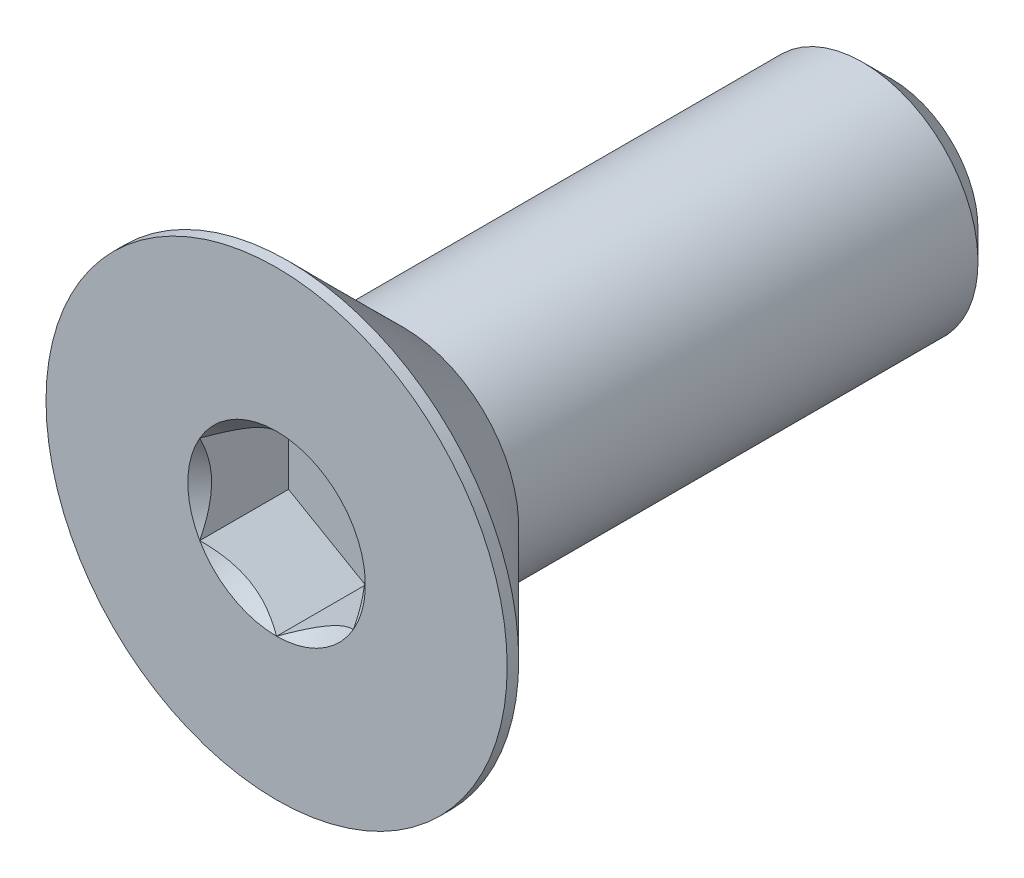
ISO-10303-21;
HEADER;
FILE_DESCRIPTION(('STEP AP214'),'2;1');
FILE_NAME('part.step','',(''),(''),'','','');
FILE_SCHEMA(('AUTOMOTIVE_DESIGN { 1 0 10303 214 1 1 1 1 }'));
ENDSEC;
DATA;
#1=APPLICATION_CONTEXT('core data for automotive mechanical design processes');
#2=APPLICATION_PROTOCOL_DEFINITION('international standard','automotive_design',2000,#1);
#3=PRODUCT_CONTEXT('',#1,'mechanical');
#4=PRODUCT('Part','Part','',(#3));
#5=PRODUCT_RELATED_PRODUCT_CATEGORY('part','',(#4));
#6=PRODUCT_DEFINITION_FORMATION('','',#4);
#7=PRODUCT_DEFINITION_CONTEXT('part definition',#1,'design');
#8=PRODUCT_DEFINITION('design','',#6,#7);
#9=PRODUCT_DEFINITION_SHAPE('','',#8);
#10=(LENGTH_UNIT() NAMED_UNIT(*) SI_UNIT(.MILLI.,.METRE.));
#11=(NAMED_UNIT(*) PLANE_ANGLE_UNIT() SI_UNIT($,.RADIAN.));
#12=(NAMED_UNIT(*) SI_UNIT($,.STERADIAN.) SOLID_ANGLE_UNIT());
#13=UNCERTAINTY_MEASURE_WITH_UNIT(LENGTH_MEASURE(1.E-05),#10,'distance_accuracy_value','');
#14=(GEOMETRIC_REPRESENTATION_CONTEXT(3) GLOBAL_UNCERTAINTY_ASSIGNED_CONTEXT((#13)) GLOBAL_UNIT_ASSIGNED_CONTEXT((#10,
#11,#12)) REPRESENTATION_CONTEXT('',''));
#15=CARTESIAN_POINT('',(0.,0.,0.));
#16=DIRECTION('',(0.,0.,1.));
#17=DIRECTION('',(1.,0.,0.));
#18=AXIS2_PLACEMENT_3D('',#15,#16,#17);
#19=CARTESIAN_POINT('',(2.22044604925031E-13,0.,-16.));
#20=DIRECTION('',(0.,0.,-1.));
#21=DIRECTION('',(0.,1.,0.));
#22=AXIS2_PLACEMENT_3D('',#19,#20,#21);
#23=CYLINDRICAL_SURFACE('',#22,3.);
#24=CARTESIAN_POINT('',(0.,0.,-15.25));
#25=DIRECTION('',(0.,0.,-1.));
#26=DIRECTION('',(0.,1.,0.));
#27=AXIS2_PLACEMENT_3D('',#24,#25,#26);
#28=CIRCLE('',#27,3.);
#29=CARTESIAN_POINT('',(0.,3.,-15.25));
#30=VERTEX_POINT('',#29);
#31=EDGE_CURVE('E55',#30,#30,#28,.F.);
#32=ORIENTED_EDGE('',*,*,#31,.T.);
#33=EDGE_LOOP('',(#32));
#34=FACE_BOUND('',#33,.T.);
#35=CARTESIAN_POINT('',(1.11022302462516E-13,0.,-3.3));
#36=DIRECTION('',(0.,0.,1.));
#37=DIRECTION('',(0.,-1.,0.));
#38=AXIS2_PLACEMENT_3D('',#35,#36,#37);
#39=CIRCLE('',#38,3.00000000000001);
#40=CARTESIAN_POINT('',(1.11022302462516E-13,-3.00000000000001,-3.29999999999999));
#41=VERTEX_POINT('',#40);
#42=EDGE_CURVE('E195',#41,#41,#39,.T.);
#43=ORIENTED_EDGE('',*,*,#42,.F.);
#44=EDGE_LOOP('',(#43));
#45=FACE_BOUND('',#44,.T.);
#46=ADVANCED_FACE('F40',(#34,#45),#23,.T.);
#47=CARTESIAN_POINT('',(2.22044604925031E-13,-2.99999999999984,-16.));
#48=DIRECTION('',(0.,0.,-1.));
#49=DIRECTION('',(0.,1.,0.));
#50=AXIS2_PLACEMENT_3D('',#47,#48,#49);
#51=PLANE('',#50);
#52=CARTESIAN_POINT('',(2.22044604925031E-13,0.,-16.));
#53=DIRECTION('',(0.,0.,-1.));
#54=DIRECTION('',(0.,1.,0.));
#55=AXIS2_PLACEMENT_3D('',#52,#53,#54);
#56=CIRCLE('',#55,2.25);
#57=CARTESIAN_POINT('',(2.22044604925031E-13,2.25000000000006,-16.));
#58=VERTEX_POINT('',#57);
#59=EDGE_CURVE('E207',#58,#58,#56,.T.);
#60=ORIENTED_EDGE('',*,*,#59,.T.);
#61=EDGE_LOOP('',(#60));
#62=FACE_BOUND('',#61,.T.);
#63=ADVANCED_FACE('F220',(#62),#51,.T.);
#64=CARTESIAN_POINT('',(2.22044604925031E-13,0.,-16.));
#65=DIRECTION('',(0.,0.,1.));
#66=DIRECTION('',(0.,-1.,0.));
#67=AXIS2_PLACEMENT_3D('',#64,#65,#66);
#68=CONICAL_SURFACE('',#67,2.25,0.785398163397445);
#69=ORIENTED_EDGE('',*,*,#31,.F.);
#70=EDGE_LOOP('',(#69));
#71=FACE_BOUND('',#70,.T.);
#72=ORIENTED_EDGE('',*,*,#59,.F.);
#73=EDGE_LOOP('',(#72));
#74=FACE_BOUND('',#73,.T.);
#75=ADVANCED_FACE('F42',(#71,#74),#68,.T.);
#76=CARTESIAN_POINT('',(0.,0.,0.));
#77=DIRECTION('',(0.,0.,1.));
#78=DIRECTION('',(0.,-1.,0.));
#79=AXIS2_PLACEMENT_3D('',#76,#77,#78);
#80=CYLINDRICAL_SURFACE('',#79,6.);
#81=CARTESIAN_POINT('',(0.,0.,0.));
#82=DIRECTION('',(0.,0.,1.));
#83=DIRECTION('',(0.,-1.,0.));
#84=AXIS2_PLACEMENT_3D('',#81,#82,#83);
#85=CIRCLE('',#84,6.);
#86=CARTESIAN_POINT('',(0.,-6.,0.));
#87=VERTEX_POINT('',#86);
#88=EDGE_CURVE('E203',#87,#87,#85,.T.);
#89=ORIENTED_EDGE('',*,*,#88,.F.);
#90=EDGE_LOOP('',(#89));
#91=FACE_BOUND('',#90,.T.);
#92=CARTESIAN_POINT('',(1.11022302462516E-13,0.,-0.300000000000022));
#93=DIRECTION('',(0.,0.,1.));
#94=DIRECTION('',(0.,-1.,0.));
#95=AXIS2_PLACEMENT_3D('',#92,#93,#94);
#96=CIRCLE('',#95,6.);
#97=CARTESIAN_POINT('',(1.11022302462516E-13,-5.99999999999995,-0.300000000000015));
#98=VERTEX_POINT('',#97);
#99=EDGE_CURVE('E199',#98,#98,#96,.T.);
#100=ORIENTED_EDGE('',*,*,#99,.T.);
#101=EDGE_LOOP('',(#100));
#102=FACE_BOUND('',#101,.T.);
#103=ADVANCED_FACE('F219',(#91,#102),#80,.T.);
#104=CARTESIAN_POINT('',(1.11022302462516E-13,0.,-3.3));
#105=DIRECTION('',(0.,0.,1.));
#106=DIRECTION('',(0.,-1.,0.));
#107=AXIS2_PLACEMENT_3D('',#104,#105,#106);
#108=CONICAL_SURFACE('',#107,3.00000000000001,0.785398163397449);
#109=ORIENTED_EDGE('',*,*,#99,.F.);
#110=EDGE_LOOP('',(#109));
#111=FACE_BOUND('',#110,.T.);
#112=ORIENTED_EDGE('',*,*,#42,.T.);
#113=EDGE_LOOP('',(#112));
#114=FACE_BOUND('',#113,.T.);
#115=ADVANCED_FACE('F230',(#111,#114),#108,.T.);
#116=CARTESIAN_POINT('',(1.11022302462516E-13,-2.99999999999989,0.));
#117=DIRECTION('',(0.,0.,1.));
#118=DIRECTION('',(0.,-1.,0.));
#119=AXIS2_PLACEMENT_3D('',#116,#117,#118);
#120=PLANE('',#119);
#121=CARTESIAN_POINT('',(0.,0.,0.));
#122=DIRECTION('',(0.,0.,1.));
#123=DIRECTION('',(1.,0.,0.));
#124=AXIS2_PLACEMENT_3D('',#121,#122,#123);
#125=CIRCLE('',#124,2.3094010767585);
#126=CARTESIAN_POINT('',(-1.11022302462516E-13,-2.30940107675831,0.));
#127=VERTEX_POINT('',#126);
#128=CARTESIAN_POINT('',(2.,-1.15470053837913,0.));
#129=VERTEX_POINT('',#128);
#130=EDGE_CURVE('E101',#127,#129,#125,.T.);
#131=ORIENTED_EDGE('',*,*,#130,.F.);
#132=CARTESIAN_POINT('',(-1.99999999999989,-1.15470053837918,0.));
#133=VERTEX_POINT('',#132);
#134=EDGE_CURVE('E61',#133,#127,#125,.T.);
#135=ORIENTED_EDGE('',*,*,#134,.F.);
#136=CARTESIAN_POINT('',(-2.,1.15470053837924,0.));
#137=VERTEX_POINT('',#136);
#138=EDGE_CURVE('E152',#137,#133,#125,.T.);
#139=ORIENTED_EDGE('',*,*,#138,.F.);
#140=CARTESIAN_POINT('',(-2.22044604925031E-13,2.3094010767587,0.));
#141=VERTEX_POINT('',#140);
#142=EDGE_CURVE('E68',#141,#137,#125,.T.);
#143=ORIENTED_EDGE('',*,*,#142,.F.);
#144=CARTESIAN_POINT('',(1.99999999999978,1.15470053837946,0.));
#145=VERTEX_POINT('',#144);
#146=EDGE_CURVE('E140',#145,#141,#125,.T.);
#147=ORIENTED_EDGE('',*,*,#146,.F.);
#148=EDGE_CURVE('E110',#129,#145,#125,.T.);
#149=ORIENTED_EDGE('',*,*,#148,.F.);
#150=EDGE_LOOP('',(#131,#135,#139,#143,#147,#149));
#151=FACE_BOUND('',#150,.T.);
#152=ORIENTED_EDGE('',*,*,#88,.T.);
#153=EDGE_LOOP('',(#152));
#154=FACE_BOUND('',#153,.T.);
#155=ADVANCED_FACE('F138',(#151,#154),#120,.T.);
#156=CARTESIAN_POINT('',(0.,0.,0.));
#157=DIRECTION('',(0.,0.,1.));
#158=DIRECTION('',(1.,0.,0.));
#159=AXIS2_PLACEMENT_3D('',#156,#157,#158);
#160=CONICAL_SURFACE('',#159,2.3094010767585,0.78539816339745);
#161=ORIENTED_EDGE('',*,*,#148,.T.);
#162=CARTESIAN_POINT('',(2.00000000000011,-2.30294417326427,0.740771355280688));
#163=CARTESIAN_POINT('',(2.00000000000011,-2.24687002696274,0.698443273869221));
#164=CARTESIAN_POINT('',(2.00000000000011,-2.19048190568578,0.656525157097884));
#165=CARTESIAN_POINT('',(2.00000000000011,-2.07695390526148,0.573690418075182));
#166=CARTESIAN_POINT('',(2.00000000000011,-2.01981384095226,0.532774049872569));
#167=CARTESIAN_POINT('',(2.00000000000011,-1.90424016831611,0.451833452203649));
#168=CARTESIAN_POINT('',(2.00000000000011,-1.8457999676976,0.411818591735218));
#169=CARTESIAN_POINT('',(2.00000000000011,-1.72792745485623,0.333288993820327));
#170=CARTESIAN_POINT('',(2.00000000000011,-1.66849521315183,0.294774150389594));
#171=CARTESIAN_POINT('',(2.00000000000011,-1.4816299572957,0.177640651720354));
#172=CARTESIAN_POINT('',(2.00000000000011,-1.35220318180733,0.102145901825405));
#173=CARTESIAN_POINT('',(2.00000000000011,-1.08689521605221,-0.0359506489476411));
#174=CARTESIAN_POINT('',(2.00000000000011,-0.951037764035708,-0.0985959140560371));
#175=CARTESIAN_POINT('',(2.00000000000011,-0.747111912337708,-0.175236456097212));
#176=CARTESIAN_POINT('',(2.00000000000011,-0.682064034234178,-0.197232820052666));
#177=CARTESIAN_POINT('',(2.00000000000011,-0.550398103397349,-0.236003312312233));
#178=CARTESIAN_POINT('',(2.00000000000011,-0.483779942833362,-0.25277708085234));
#179=CARTESIAN_POINT('',(2.00000000000011,-0.350484328974839,-0.279951742093204));
#180=CARTESIAN_POINT('',(2.00000000000011,-0.283829489499974,-0.290461823238892));
#181=CARTESIAN_POINT('',(2.00000000000011,-0.149806987290315,-0.304903914443445));
#182=CARTESIAN_POINT('',(2.00000000000011,-0.0824394490928071,-0.3088370552601));
#183=CARTESIAN_POINT('',(2.00000000000011,0.0499055621214823,-0.309833523070376));
#184=CARTESIAN_POINT('',(2.00000000000012,0.114881284963569,-0.30714035515963));
#185=CARTESIAN_POINT('',(2.00000000000011,0.244275921290632,-0.295569929600288));
#186=CARTESIAN_POINT('',(2.0000000000001,0.308694780068696,-0.286692071196753));
#187=CARTESIAN_POINT('',(2.00000000000012,0.437599788400936,-0.263086340748452));
#188=CARTESIAN_POINT('',(2.00000000000016,0.502067428429062,-0.248258916605757));
#189=CARTESIAN_POINT('',(2.00000000000007,0.629594322371815,-0.213542116439877));
#190=CARTESIAN_POINT('',(1.99999999999994,0.692653693651466,-0.19365316396948));
#191=CARTESIAN_POINT('',(1.99999999999978,0.891187888928423,-0.123553020856651));
#192=CARTESIAN_POINT('',(2.00000000000003,1.02383545674819,-0.0653581998253135));
#193=CARTESIAN_POINT('',(2.0000000000002,1.2829093210937,0.0640305752409503));
#194=CARTESIAN_POINT('',(2.00000000000013,1.40931112542926,0.135271231158357));
#195=CARTESIAN_POINT('',(2.00000000000011,1.5920044138885,0.246441991562786));
#196=CARTESIAN_POINT('',(2.00000000000011,1.65027548974478,0.283182190008393));
#197=CARTESIAN_POINT('',(2.00000000000011,1.76581760334352,0.358214513820608));
#198=CARTESIAN_POINT('',(2.00000000000011,1.82308856486637,0.396506756737753));
#199=CARTESIAN_POINT('',(2.00000000000012,1.93629654702499,0.474042263666883));
#200=CARTESIAN_POINT('',(2.00000000000013,1.99224062439413,0.513275275702316));
#201=CARTESIAN_POINT('',(2.00000000000009,2.10336423965705,0.592778830271386));
#202=CARTESIAN_POINT('',(2.00000000000003,2.15854398356745,0.633049084518533));
#203=CARTESIAN_POINT('',(1.99999999999989,2.21340370625411,0.673744237646934));
#204=B_SPLINE_CURVE_WITH_KNOTS('',3,(#162,#163,#164,#165,#166,#167,#168,#169,#170,#171,#172,
#173,#174,#175,#176,#177,#178,#179,#180,#181,#182,#183,#184,#185,#186,#187,#188,#189,#190,#191,
#192,#193,#194,#195,#196,#197,#198,#199,#200,#201,#202,#203),.UNSPECIFIED.,.F.,.F.,(4,2,2,2,2,2,
2,2,2,2,2,2,2,2,2,2,2,2,2,2,4),(0.,0.210772732016981,0.421598374738784,0.634057554744567,
0.846501696032124,1.29562155480986,1.74319622856084,1.94902062142325,2.15485918958128,
2.35699582530217,2.559097704575,2.75388435576873,2.94868993036088,3.14690093471659,
3.34509535806575,3.77838155838755,4.21325029906854,4.41989056664086,4.62654651432571,
4.83152377076239,5.03644465872335),.UNSPECIFIED.);
#205=EDGE_CURVE('E11',#129,#145,#204,.T.);
#206=ORIENTED_EDGE('',*,*,#205,.F.);
#207=EDGE_LOOP('',(#161,#206));
#208=FACE_BOUND('',#207,.T.);
#209=ADVANCED_FACE('F114',(#208),#160,.F.);
#210=ORIENTED_EDGE('',*,*,#146,.T.);
#211=CARTESIAN_POINT('',(2.00020000000012,1.15458506832544,0.000115478713612338));
#212=CARTESIAN_POINT('',(1.9314469659693,1.1942796510305,-0.0395469097745199));
#213=CARTESIAN_POINT('',(1.86154425786446,1.23463799837186,-0.0768800177159727));
#214=CARTESIAN_POINT('',(1.7190047554495,1.31693321846128,-0.145236314864007));
#215=CARTESIAN_POINT('',(1.64635440243459,1.3588779193312,-0.176221466262924));
#216=CARTESIAN_POINT('',(1.49985839894594,1.44345742638051,-0.229299783456038));
#217=CARTESIAN_POINT('',(1.42605006475357,1.4860706879948,-0.251526372823611));
#218=CARTESIAN_POINT('',(1.27680836816469,1.57223542169499,-0.285771183325048));
#219=CARTESIAN_POINT('',(1.20137956608194,1.6157842608825,-0.297814970855859));
#220=CARTESIAN_POINT('',(1.07138449932894,1.69083694766554,-0.308681488094468));
#221=CARTESIAN_POINT('',(1.01698621602979,1.72224381117146,-0.310290246390173));
#222=CARTESIAN_POINT('',(0.908278544480123,1.78500621460344,-0.307581122401498));
#223=CARTESIAN_POINT('',(0.853969194078523,1.8163617326774,-0.303261162242198));
#224=CARTESIAN_POINT('',(0.745863272410539,1.87877671565343,-0.288940432590264));
#225=CARTESIAN_POINT('',(0.692067343445055,1.90983580972289,-0.278933307238198));
#226=CARTESIAN_POINT('',(0.585405737694339,1.97141691651537,-0.253787569750469));
#227=CARTESIAN_POINT('',(0.532539989929295,2.0019389702186,-0.238649350957778));
#228=CARTESIAN_POINT('',(0.397120266910167,2.08012358375739,-0.193705496570737));
#229=CARTESIAN_POINT('',(0.315406165150329,2.12730124240477,-0.160511160574251));
#230=CARTESIAN_POINT('',(0.195252962741871,2.19667172615917,-0.104474176828706));
#231=CARTESIAN_POINT('',(0.155657147890482,2.2195323805224,-0.0847852970531069));
#232=CARTESIAN_POINT('',(0.0771990411117786,2.26483018959127,-0.0436126816351308));
#233=CARTESIAN_POINT('',(0.0383363164059168,2.28726759416172,-0.0221300483487393));
#234=CARTESIAN_POINT('',(-0.000200000000338818,2.30951654681255,0.000115478713640094));
#235=B_SPLINE_CURVE_WITH_KNOTS('',3,(#211,#212,#213,#214,#215,#216,#217,#218,#219,#220,#221,
#222,#223,#224,#225,#226,#227,#228,#229,#230,#231,#232,#233,#234),.UNSPECIFIED.,.F.,.F.,(4,2,2,
2,2,2,2,2,2,2,2,4),(0.,0.266420613771152,0.534393751523502,0.798110374377044,1.06116288956954,
1.2493990680374,1.43770123566264,1.62621426093946,1.81471283831929,2.11415604834179,
2.26347170717833,2.41269626969823),.UNSPECIFIED.);
#236=EDGE_CURVE('E145',#145,#141,#235,.T.);
#237=ORIENTED_EDGE('',*,*,#236,.F.);
#238=EDGE_LOOP('',(#210,#237));
#239=FACE_BOUND('',#238,.T.);
#240=ADVANCED_FACE('F333',(#239),#160,.F.);
#241=ORIENTED_EDGE('',*,*,#142,.T.);
#242=CARTESIAN_POINT('',(0.000199999999894729,2.30951654681233,0.000115478713640094));
#243=CARTESIAN_POINT('',(-0.0685530340308628,2.26982196410714,-0.0395469097743652));
#244=CARTESIAN_POINT('',(-0.138455742135685,2.22946361676576,-0.0768800177157799));
#245=CARTESIAN_POINT('',(-0.280995244550633,2.14716839667634,-0.145236314863797));
#246=CARTESIAN_POINT('',(-0.353645597565564,2.10522369580644,-0.176221466262731));
#247=CARTESIAN_POINT('',(-0.500141601054214,2.02064418875708,-0.229299783455776));
#248=CARTESIAN_POINT('',(-0.573949935246565,1.97803092714272,-0.251526372823264));
#249=CARTESIAN_POINT('',(-0.723191631835499,1.8918661934427,-0.285771183324878));
#250=CARTESIAN_POINT('',(-0.798620433918323,1.84831735425541,-0.297814970855952));
#251=CARTESIAN_POINT('',(-0.928615500671235,1.77326466747234,-0.308681488094448));
#252=CARTESIAN_POINT('',(-0.983013783970277,1.74185780396627,-0.310290246389937));
#253=CARTESIAN_POINT('',(-1.09172145551984,1.67909540053421,-0.307581122401118));
#254=CARTESIAN_POINT('',(-1.14603080592144,1.6477398824603,-0.303261162241888));
#255=CARTESIAN_POINT('',(-1.25413672758939,1.58532489948432,-0.288940432589972));
#256=CARTESIAN_POINT('',(-1.30793265655484,1.55426580541486,-0.278933307237853));
#257=CARTESIAN_POINT('',(-1.41459426230554,1.49268469862241,-0.253787569750255));
#258=CARTESIAN_POINT('',(-1.46746001007061,1.46216264491921,-0.238649350957748));
#259=CARTESIAN_POINT('',(-1.60287973308968,1.38397803138048,-0.193705496570861));
#260=CARTESIAN_POINT('',(-1.68459383484936,1.33680037273312,-0.160511160574155));
#261=CARTESIAN_POINT('',(-1.80474703725771,1.26742988897877,-0.104474176828581));
#262=CARTESIAN_POINT('',(-1.84434285210909,1.24456923461555,-0.08478529705302));
#263=CARTESIAN_POINT('',(-1.92280095888775,1.1992714255467,-0.0436126816351175));
#264=CARTESIAN_POINT('',(-1.96166368359358,1.17683402097627,-0.0221300483487614));
#265=CARTESIAN_POINT('',(-2.00019999999979,1.15458506832544,0.000115478713640094));
#266=B_SPLINE_CURVE_WITH_KNOTS('',3,(#242,#243,#244,#245,#246,#247,#248,#249,#250,#251,#252,
#253,#254,#255,#256,#257,#258,#259,#260,#261,#262,#263,#264,#265),.UNSPECIFIED.,.F.,.F.,(4,2,2,
2,2,2,2,2,2,2,2,4),(0.,0.266420613771059,0.534393751523439,0.798110374376992,1.06116288956944,
1.24939906803719,1.43770123566236,1.62621426093912,1.81471283831884,2.11415604834112,
2.26347170717756,2.41269626969734),.UNSPECIFIED.);
#267=EDGE_CURVE('E151',#141,#137,#266,.T.);
#268=ORIENTED_EDGE('',*,*,#267,.F.);
#269=EDGE_LOOP('',(#241,#268));
#270=FACE_BOUND('',#269,.T.);
#271=ADVANCED_FACE('F329',(#270),#160,.F.);
#272=ORIENTED_EDGE('',*,*,#138,.T.);
#273=CARTESIAN_POINT('',(-2.,-2.3029441729292,0.740771355027724));
#274=CARTESIAN_POINT('',(-2.,-2.2468700266371,0.698443273625958));
#275=CARTESIAN_POINT('',(-2.,-2.19048190536958,0.65652515686433));
#276=CARTESIAN_POINT('',(-2.,-2.07695390496424,0.573690417861012));
#277=CARTESIAN_POINT('',(-2.,-2.01981384066454,0.532774049668073));
#278=CARTESIAN_POINT('',(-2.,-1.90424016804776,0.451833452018567));
#279=CARTESIAN_POINT('',(-2.,-1.8457999674391,0.411818591559874));
#280=CARTESIAN_POINT('',(-2.,-1.72792745461761,0.333288993664303));
#281=CARTESIAN_POINT('',(-2.,-1.66849521292325,0.294774150243153));
#282=CARTESIAN_POINT('',(-2.00000000000001,-1.48162995710022,0.177640651604314));
#283=CARTESIAN_POINT('',(-2.00000000000005,-1.35220318163539,0.102145901729672));
#284=CARTESIAN_POINT('',(-1.99999999999996,-1.0868952159293,-0.0359506490055974));
#285=CARTESIAN_POINT('',(-1.99999999999984,-0.951037763938264,-0.0985959140964972));
#286=CARTESIAN_POINT('',(-1.99999999999992,-0.747111912259461,-0.175236456124851));
#287=CARTESIAN_POINT('',(-1.99999999999998,-0.682064034147896,-0.197232820080873));
#288=CARTESIAN_POINT('',(-2.00000000000002,-0.550398103294713,-0.236003312339866));
#289=CARTESIAN_POINT('',(-2.00000000000001,-0.483779942722407,-0.252777080878832));
#290=CARTESIAN_POINT('',(-2.,-0.350484328847527,-0.279951742115577));
#291=CARTESIAN_POINT('',(-2.,-0.283829489364628,-0.290461823258335));
#292=CARTESIAN_POINT('',(-2.,-0.149806987139159,-0.3049039144551));
#293=CARTESIAN_POINT('',(-2.,-0.0824394489338748,-0.308837055266897));
#294=CARTESIAN_POINT('',(-2.,0.0499055622947484,-0.309833523066275));
#295=CARTESIAN_POINT('',(-2.,0.114881285143413,-0.307140355149575));
#296=CARTESIAN_POINT('',(-2.,0.244275921482964,-0.29556992957728));
#297=CARTESIAN_POINT('',(-2.,0.308694780266939,-0.286692071166745));
#298=CARTESIAN_POINT('',(-2.,0.437599788610853,-0.263086340703817));
#299=CARTESIAN_POINT('',(-2.,0.502067428644725,-0.248258916553454));
#300=CARTESIAN_POINT('',(-2.,0.629594322598399,-0.213542116372));
#301=CARTESIAN_POINT('',(-2.,0.692653693883225,-0.193653163893698));
#302=CARTESIAN_POINT('',(-2.,0.891187889210607,-0.123553020743775));
#303=CARTESIAN_POINT('',(-2.,1.02383545707313,-0.0653581996784601));
#304=CARTESIAN_POINT('',(-2.,1.28290932150082,0.0640305754596179));
#305=CARTESIAN_POINT('',(-2.,1.40931112587578,0.135271231414888));
#306=CARTESIAN_POINT('',(-2.,1.59200441438972,0.246441991874775));
#307=CARTESIAN_POINT('',(-2.,1.650275490262,0.283182190337432));
#308=CARTESIAN_POINT('',(-2.,1.76581760389252,0.358214514183827));
#309=CARTESIAN_POINT('',(-2.,1.82308856543114,0.396506757118102));
#310=CARTESIAN_POINT('',(-2.,1.93629654762094,0.474042264081296));
#311=CARTESIAN_POINT('',(-2.00000000000001,1.99224062500548,0.513275276133663));
#312=CARTESIAN_POINT('',(-1.99999999999999,2.10336424029911,0.592778830736584));
#313=CARTESIAN_POINT('',(-1.99999999999996,2.1585439842248,0.633049085000649));
#314=CARTESIAN_POINT('',(-1.99999999999989,2.21340370692674,0.673744238145951));
#315=B_SPLINE_CURVE_WITH_KNOTS('',3,(#273,#274,#275,#276,#277,#278,#279,#280,#281,#282,#283,
#284,#285,#286,#287,#288,#289,#290,#291,#292,#293,#294,#295,#296,#297,#298,#299,#300,#301,#302,
#303,#304,#305,#306,#307,#308,#309,#310,#311,#312,#313,#314),.UNSPECIFIED.,.F.,.F.,(4,2,2,2,2,2,
2,2,2,2,2,2,2,2,2,2,2,2,2,2,4),(0.,0.210772731976878,0.421598374658564,0.634057554623451,
0.846501695870122,1.29562155455616,1.74319622821635,1.94902062110206,2.15485918928333,
2.35699582502652,2.55909770432165,2.75388435553576,2.94868993014829,3.14690093452595,
3.34509535789705,3.77838155837659,4.21325029921632,4.41989056685655,4.6265465146093,
4.83152377111299,5.03644465914096),.UNSPECIFIED.);
#316=EDGE_CURVE('E164',#137,#133,#315,.F.);
#317=ORIENTED_EDGE('',*,*,#316,.F.);
#318=EDGE_LOOP('',(#272,#317));
#319=FACE_BOUND('',#318,.T.);
#320=ADVANCED_FACE('F162',(#319),#160,.F.);
#321=ORIENTED_EDGE('',*,*,#134,.T.);
#322=CARTESIAN_POINT('',(-2.00020000000001,-1.15458506832544,0.000115478713674788));
#323=CARTESIAN_POINT('',(-1.93144696596926,-1.19427965103055,-0.0395469097745041));
#324=CARTESIAN_POINT('',(-1.86154425786443,-1.23463799837191,-0.076880017715971));
#325=CARTESIAN_POINT('',(-1.71900475544949,-1.31693321846129,-0.145236314864008));
#326=CARTESIAN_POINT('',(-1.64635440243457,-1.35887791933119,-0.176221466262913));
#327=CARTESIAN_POINT('',(-1.49985839894595,-1.44345742638055,-0.229299783456026));
#328=CARTESIAN_POINT('',(-1.42605006475362,-1.48607068799492,-0.251526372823607));
#329=CARTESIAN_POINT('',(-1.27680836816461,-1.57223542169492,-0.285771183325032));
#330=CARTESIAN_POINT('',(-1.2013795660817,-1.61578426088216,-0.297814970855822));
#331=CARTESIAN_POINT('',(-1.07138449932874,-1.6908369476653,-0.308681488094435));
#332=CARTESIAN_POINT('',(-1.01698621602971,-1.72224381117143,-0.310290246390152));
#333=CARTESIAN_POINT('',(-0.908278544480125,-1.78500621460355,-0.307581122401487));
#334=CARTESIAN_POINT('',(-0.853969194078488,-1.81636173267746,-0.303261162242185));
#335=CARTESIAN_POINT('',(-0.745863272410497,-1.87877671565346,-0.288940432590236));
#336=CARTESIAN_POINT('',(-0.692067343445043,-1.90983580972296,-0.278933307238159));
#337=CARTESIAN_POINT('',(-0.585405737694296,-1.97141691651538,-0.253787569750464));
#338=CARTESIAN_POINT('',(-0.532539989929193,-2.00193897021851,-0.238649350957818));
#339=CARTESIAN_POINT('',(-0.397120266910124,-2.08012358375719,-0.193705496570826));
#340=CARTESIAN_POINT('',(-0.31540616515048,-2.12730124240464,-0.1605111605743));
#341=CARTESIAN_POINT('',(-0.195252962742172,-2.19667172615904,-0.104474176828833));
#342=CARTESIAN_POINT('',(-0.155657147890809,-2.21953238052225,-0.084785297053281));
#343=CARTESIAN_POINT('',(-0.0771990411121823,-2.26483018959103,-0.0436126816353061));
#344=CARTESIAN_POINT('',(-0.0383363164063719,-2.28726759416142,-0.0221300483488681));
#345=CARTESIAN_POINT('',(0.000199999999783707,-2.30951654681216,0.000115478713674788));
#346=B_SPLINE_CURVE_WITH_KNOTS('',3,(#322,#323,#324,#325,#326,#327,#328,#329,#330,#331,#332,
#333,#334,#335,#336,#337,#338,#339,#340,#341,#342,#343,#344,#345),.UNSPECIFIED.,.F.,.F.,(4,2,2,
2,2,2,2,2,2,2,2,4),(0.,0.26642061377112,0.534393751523432,0.798110374377,1.06116288956953,
1.24939906803738,1.43770123566262,1.62621426093944,1.81471283831924,2.11415604834142,
2.26347170717781,2.41269626969757),.UNSPECIFIED.);
#347=EDGE_CURVE('E127',#133,#127,#346,.T.);
#348=ORIENTED_EDGE('',*,*,#347,.F.);
#349=EDGE_LOOP('',(#321,#348));
#350=FACE_BOUND('',#349,.T.);
#351=ADVANCED_FACE('F259',(#350),#160,.F.);
#352=ORIENTED_EDGE('',*,*,#130,.T.);
#353=CARTESIAN_POINT('',(-0.000199999999894729,-2.30951654681227,0.000115478713674788));
#354=CARTESIAN_POINT('',(0.0685530340307229,-2.26982196410696,-0.0395469097745399));
#355=CARTESIAN_POINT('',(0.138455742135511,-2.22946361676554,-0.0768800177160178));
#356=CARTESIAN_POINT('',(0.280995244550428,-2.14716839667611,-0.145236314864056));
#357=CARTESIAN_POINT('',(0.353645597565361,-2.10522369580623,-0.176221466262953));
#358=CARTESIAN_POINT('',(0.500141601053971,-2.02064418875686,-0.229299783456061));
#359=CARTESIAN_POINT('',(0.573949935246281,-1.97803092714246,-0.251526372823647));
#360=CARTESIAN_POINT('',(0.723191631835334,-1.89186619344254,-0.285771183325039));
#361=CARTESIAN_POINT('',(0.798620433918317,-1.84831735425541,-0.297814970855792));
#362=CARTESIAN_POINT('',(0.928615500671246,-1.77326466747224,-0.308681488094408));
#363=CARTESIAN_POINT('',(0.983013783970221,-1.74185780396602,-0.310290246390148));
#364=CARTESIAN_POINT('',(1.09172145551975,-1.67909540053386,-0.307581122401495));
#365=CARTESIAN_POINT('',(1.1460308059214,-1.64773988246,-0.303261162242184));
#366=CARTESIAN_POINT('',(1.25413672758937,-1.58532489948398,-0.288940432590232));
#367=CARTESIAN_POINT('',(1.30793265655478,-1.55426580541443,-0.278933307238161));
#368=CARTESIAN_POINT('',(1.41459426230559,-1.49268469862215,-0.253787569750458));
#369=CARTESIAN_POINT('',(1.46746001007079,-1.46216264491921,-0.238649350957798));
#370=CARTESIAN_POINT('',(1.60287973308993,-1.38397803138064,-0.193705496570796));
#371=CARTESIAN_POINT('',(1.68459383484942,-1.33680037273288,-0.160511160574289));
#372=CARTESIAN_POINT('',(1.80474703725769,-1.26742988897837,-0.104474176828812));
#373=CARTESIAN_POINT('',(1.84434285210907,-1.24456923461518,-0.0847852970532506));
#374=CARTESIAN_POINT('',(1.92280095888773,-1.19927142554641,-0.0436126816352789));
#375=CARTESIAN_POINT('',(1.96166368359355,-1.17683402097601,-0.0221300483488538));
#376=CARTESIAN_POINT('',(2.00019999999967,-1.15458506832516,0.000115478713647033));
#377=B_SPLINE_CURVE_WITH_KNOTS('',3,(#353,#354,#355,#356,#357,#358,#359,#360,#361,#362,#363,
#364,#365,#366,#367,#368,#369,#370,#371,#372,#373,#374,#375,#376),.UNSPECIFIED.,.F.,.F.,(4,2,2,
2,2,2,2,2,2,2,2,4),(0.,0.266420613771132,0.53439375152344,0.798110374376997,1.06116288956952,
1.24939906803735,1.43770123566256,1.62621426093935,1.81471283831913,2.11415604834136,
2.26347170717778,2.41269626969755),.UNSPECIFIED.);
#378=EDGE_CURVE('E105',#127,#129,#377,.T.);
#379=ORIENTED_EDGE('',*,*,#378,.F.);
#380=EDGE_LOOP('',(#352,#379));
#381=FACE_BOUND('',#380,.T.);
#382=ADVANCED_FACE('F103',(#381),#160,.F.);
#383=CARTESIAN_POINT('',(2.00000000000011,-1.15470053837918,-2.31000000000003));
#384=DIRECTION('',(0.,0.,1.));
#385=DIRECTION('',(1.,0.,0.));
#386=AXIS2_PLACEMENT_3D('',#383,#384,#385);
#387=PLANE('',#386);
#388=DIRECTION('',(0.866025403784439,0.5,0.));
#389=VECTOR('',#388,1.);
#390=CARTESIAN_POINT('',(0.,-2.30940107675831,-2.31000000000001));
#391=LINE('',#390,#389);
#392=CARTESIAN_POINT('',(0.,-2.30940107675831,-2.31000000000001));
#393=VERTEX_POINT('',#392);
#394=CARTESIAN_POINT('',(2.00000000000011,-1.15470053837918,-2.31000000000003));
#395=VERTEX_POINT('',#394);
#396=EDGE_CURVE('E126',#393,#395,#391,.T.);
#397=ORIENTED_EDGE('',*,*,#396,.T.);
#398=DIRECTION('',(0.,1.,0.));
#399=VECTOR('',#398,1.);
#400=CARTESIAN_POINT('',(2.00000000000011,-1.15470053837918,-2.31000000000003));
#401=LINE('',#400,#399);
#402=CARTESIAN_POINT('',(1.99999999999967,1.15470053837924,-2.31000000000004));
#403=VERTEX_POINT('',#402);
#404=EDGE_CURVE('E131',#395,#403,#401,.T.);
#405=ORIENTED_EDGE('',*,*,#404,.T.);
#406=DIRECTION('',(-0.866025403784439,0.500000000000001,0.));
#407=VECTOR('',#406,1.);
#408=CARTESIAN_POINT('',(1.99999999999967,1.15470053837924,-2.31000000000004));
#409=LINE('',#408,#407);
#410=CARTESIAN_POINT('',(-1.11022302462516E-13,2.30940107675859,-2.31000000000001));
#411=VERTEX_POINT('',#410);
#412=EDGE_CURVE('E293',#403,#411,#409,.T.);
#413=ORIENTED_EDGE('',*,*,#412,.T.);
#414=DIRECTION('',(-0.866025403784439,-0.5,0.));
#415=VECTOR('',#414,1.);
#416=CARTESIAN_POINT('',(-1.11022302462516E-13,2.30940107675859,-2.31000000000001));
#417=LINE('',#416,#415);
#418=CARTESIAN_POINT('',(-2.,1.15470053837918,-2.31000000000001));
#419=VERTEX_POINT('',#418);
#420=EDGE_CURVE('E296',#411,#419,#417,.T.);
#421=ORIENTED_EDGE('',*,*,#420,.T.);
#422=DIRECTION('',(0.,-1.,0.));
#423=VECTOR('',#422,1.);
#424=CARTESIAN_POINT('',(-2.,1.15470053837918,-2.31000000000001));
#425=LINE('',#424,#423);
#426=CARTESIAN_POINT('',(-1.99999999999989,-1.15470053837913,-2.30999999999998));
#427=VERTEX_POINT('',#426);
#428=EDGE_CURVE('E181',#419,#427,#425,.T.);
#429=ORIENTED_EDGE('',*,*,#428,.T.);
#430=DIRECTION('',(0.866025403784439,-0.5,0.));
#431=VECTOR('',#430,1.);
#432=CARTESIAN_POINT('',(-1.99999999999989,-1.15470053837913,-2.30999999999998));
#433=LINE('',#432,#431);
#434=EDGE_CURVE('E135',#427,#393,#433,.T.);
#435=ORIENTED_EDGE('',*,*,#434,.T.);
#436=EDGE_LOOP('',(#397,#405,#413,#421,#429,#435));
#437=FACE_BOUND('',#436,.T.);
#438=ADVANCED_FACE('F258',(#437),#387,.T.);
#439=CARTESIAN_POINT('',(2.00000000000011,-1.15470053837918,-2.31000000000003));
#440=DIRECTION('',(1.,0.,0.));
#441=DIRECTION('',(0.,1.,0.));
#442=AXIS2_PLACEMENT_3D('',#439,#440,#441);
#443=PLANE('',#442);
#444=DIRECTION('',(0.,0.,1.));
#445=VECTOR('',#444,1.);
#446=CARTESIAN_POINT('',(2.00000000000011,-1.15470053837918,-2.31000000000003));
#447=LINE('',#446,#445);
#448=EDGE_CURVE('E122',#395,#129,#447,.T.);
#449=ORIENTED_EDGE('',*,*,#448,.T.);
#450=ORIENTED_EDGE('',*,*,#205,.T.);
#451=DIRECTION('',(0.,0.,1.));
#452=VECTOR('',#451,1.);
#453=CARTESIAN_POINT('',(1.99999999999967,1.15470053837924,-2.31000000000004));
#454=LINE('',#453,#452);
#455=EDGE_CURVE('E134',#403,#145,#454,.T.);
#456=ORIENTED_EDGE('',*,*,#455,.F.);
#457=ORIENTED_EDGE('',*,*,#404,.F.);
#458=EDGE_LOOP('',(#449,#450,#456,#457));
#459=FACE_BOUND('',#458,.T.);
#460=ADVANCED_FACE('F129',(#459),#443,.F.);
#461=CARTESIAN_POINT('',(1.99999999999967,1.15470053837924,-2.31000000000004));
#462=DIRECTION('',(0.5,0.866025403784439,0.));
#463=DIRECTION('',(-0.866025403784439,0.5,0.));
#464=AXIS2_PLACEMENT_3D('',#461,#462,#463);
#465=PLANE('',#464);
#466=ORIENTED_EDGE('',*,*,#455,.T.);
#467=ORIENTED_EDGE('',*,*,#236,.T.);
#468=DIRECTION('',(0.,0.,1.));
#469=VECTOR('',#468,1.);
#470=CARTESIAN_POINT('',(-1.11022302462516E-13,2.30940107675859,-2.31000000000001));
#471=LINE('',#470,#469);
#472=EDGE_CURVE('E176',#411,#141,#471,.T.);
#473=ORIENTED_EDGE('',*,*,#472,.F.);
#474=ORIENTED_EDGE('',*,*,#412,.F.);
#475=EDGE_LOOP('',(#466,#467,#473,#474));
#476=FACE_BOUND('',#475,.T.);
#477=ADVANCED_FACE('F284',(#476),#465,.F.);
#478=CARTESIAN_POINT('',(-1.11022302462516E-13,2.30940107675859,-2.31000000000001));
#479=DIRECTION('',(-0.5,0.866025403784439,0.));
#480=DIRECTION('',(-0.866025403784439,-0.5,0.));
#481=AXIS2_PLACEMENT_3D('',#478,#479,#480);
#482=PLANE('',#481);
#483=ORIENTED_EDGE('',*,*,#472,.T.);
#484=ORIENTED_EDGE('',*,*,#267,.T.);
#485=DIRECTION('',(0.,0.,1.));
#486=VECTOR('',#485,1.);
#487=CARTESIAN_POINT('',(-2.,1.15470053837918,-2.31000000000001));
#488=LINE('',#487,#486);
#489=EDGE_CURVE('E174',#419,#137,#488,.T.);
#490=ORIENTED_EDGE('',*,*,#489,.F.);
#491=ORIENTED_EDGE('',*,*,#420,.F.);
#492=EDGE_LOOP('',(#483,#484,#490,#491));
#493=FACE_BOUND('',#492,.T.);
#494=ADVANCED_FACE('F172',(#493),#482,.F.);
#495=CARTESIAN_POINT('',(-2.,1.15470053837918,-2.31000000000001));
#496=DIRECTION('',(-1.,0.,0.));
#497=DIRECTION('',(0.,0.,1.));
#498=AXIS2_PLACEMENT_3D('',#495,#496,#497);
#499=PLANE('',#498);
#500=ORIENTED_EDGE('',*,*,#489,.T.);
#501=ORIENTED_EDGE('',*,*,#316,.T.);
#502=DIRECTION('',(0.,0.,1.));
#503=VECTOR('',#502,1.);
#504=CARTESIAN_POINT('',(-1.99999999999989,-1.15470053837913,-2.30999999999998));
#505=LINE('',#504,#503);
#506=EDGE_CURVE('E184',#427,#133,#505,.T.);
#507=ORIENTED_EDGE('',*,*,#506,.F.);
#508=ORIENTED_EDGE('',*,*,#428,.F.);
#509=EDGE_LOOP('',(#500,#501,#507,#508));
#510=FACE_BOUND('',#509,.T.);
#511=ADVANCED_FACE('F179',(#510),#499,.F.);
#512=CARTESIAN_POINT('',(-1.99999999999989,-1.15470053837913,-2.30999999999998));
#513=DIRECTION('',(-0.5,-0.866025403784439,0.));
#514=DIRECTION('',(0.866025403784439,-0.5,0.));
#515=AXIS2_PLACEMENT_3D('',#512,#513,#514);
#516=PLANE('',#515);
#517=ORIENTED_EDGE('',*,*,#506,.T.);
#518=ORIENTED_EDGE('',*,*,#347,.T.);
#519=DIRECTION('',(0.,0.,1.));
#520=VECTOR('',#519,1.);
#521=CARTESIAN_POINT('',(0.,-2.30940107675831,-2.31000000000001));
#522=LINE('',#521,#520);
#523=EDGE_CURVE('E124',#393,#127,#522,.T.);
#524=ORIENTED_EDGE('',*,*,#523,.F.);
#525=ORIENTED_EDGE('',*,*,#434,.F.);
#526=EDGE_LOOP('',(#517,#518,#524,#525));
#527=FACE_BOUND('',#526,.T.);
#528=ADVANCED_FACE('F240',(#527),#516,.F.);
#529=CARTESIAN_POINT('',(0.,-2.30940107675831,-2.31000000000001));
#530=DIRECTION('',(0.5,-0.866025403784439,0.));
#531=DIRECTION('',(0.866025403784439,0.5,0.));
#532=AXIS2_PLACEMENT_3D('',#529,#530,#531);
#533=PLANE('',#532);
#534=ORIENTED_EDGE('',*,*,#523,.T.);
#535=ORIENTED_EDGE('',*,*,#378,.T.);
#536=ORIENTED_EDGE('',*,*,#448,.F.);
#537=ORIENTED_EDGE('',*,*,#396,.F.);
#538=EDGE_LOOP('',(#534,#535,#536,#537));
#539=FACE_BOUND('',#538,.T.);
#540=ADVANCED_FACE('F120',(#539),#533,.F.);
#541=CLOSED_SHELL('',(#46,#63,#75,#103,#115,#155,#209,#240,#271,#320,#351,#382,#438,#460,#477,
#494,#511,#528,#540));
#542=MANIFOLD_SOLID_BREP('B2',#541);
#543=ADVANCED_BREP_SHAPE_REPRESENTATION('',(#18,#542),#14);
#544=SHAPE_DEFINITION_REPRESENTATION(#9,#543);
ENDSEC;
END-ISO-10303-21;
